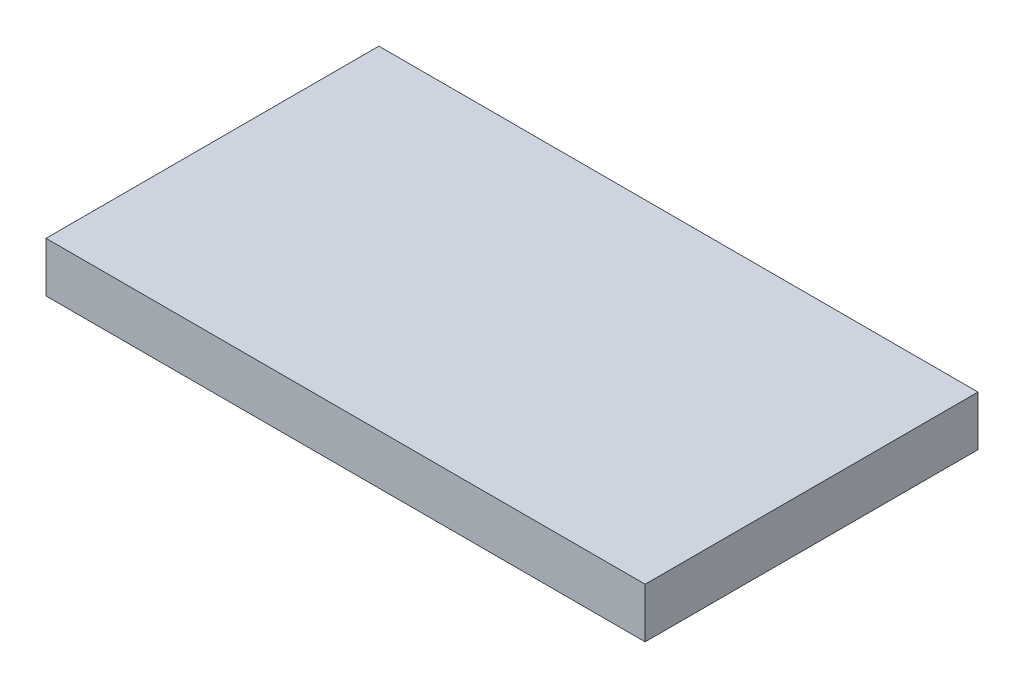
ISO-10303-21;
HEADER;
FILE_DESCRIPTION(('STEP AP214'),'2;1');
FILE_NAME('part.step','',(''),(''),'','','');
FILE_SCHEMA(('AUTOMOTIVE_DESIGN { 1 0 10303 214 1 1 1 1 }'));
ENDSEC;
DATA;
#1=APPLICATION_CONTEXT('core data for automotive mechanical design processes');
#2=APPLICATION_PROTOCOL_DEFINITION('international standard','automotive_design',2000,#1);
#3=PRODUCT_CONTEXT('',#1,'mechanical');
#4=PRODUCT('Part','Part','',(#3));
#5=PRODUCT_RELATED_PRODUCT_CATEGORY('part','',(#4));
#6=PRODUCT_DEFINITION_FORMATION('','',#4);
#7=PRODUCT_DEFINITION_CONTEXT('part definition',#1,'design');
#8=PRODUCT_DEFINITION('design','',#6,#7);
#9=PRODUCT_DEFINITION_SHAPE('','',#8);
#10=(LENGTH_UNIT() NAMED_UNIT(*) SI_UNIT(.MILLI.,.METRE.));
#11=(NAMED_UNIT(*) PLANE_ANGLE_UNIT() SI_UNIT($,.RADIAN.));
#12=(NAMED_UNIT(*) SI_UNIT($,.STERADIAN.) SOLID_ANGLE_UNIT());
#13=UNCERTAINTY_MEASURE_WITH_UNIT(LENGTH_MEASURE(1.E-05),#10,'distance_accuracy_value','');
#14=(GEOMETRIC_REPRESENTATION_CONTEXT(3) GLOBAL_UNCERTAINTY_ASSIGNED_CONTEXT((#13)) GLOBAL_UNIT_ASSIGNED_CONTEXT((#10,
#11,#12)) REPRESENTATION_CONTEXT('',''));
#15=CARTESIAN_POINT('',(0.,0.,0.));
#16=DIRECTION('',(0.,0.,1.));
#17=DIRECTION('',(1.,0.,0.));
#18=AXIS2_PLACEMENT_3D('',#15,#16,#17);
#19=CARTESIAN_POINT('',(-349.545746257883,-3.97192979348886,200.));
#20=DIRECTION('',(0.,1.,0.));
#21=DIRECTION('',(0.,0.,1.));
#22=AXIS2_PLACEMENT_3D('',#19,#20,#21);
#23=PLANE('',#22);
#24=DIRECTION('',(1.,0.,0.));
#25=VECTOR('',#24,1.);
#26=CARTESIAN_POINT('',(-349.545746257883,-3.97192979348886,0.));
#27=LINE('',#26,#25);
#28=CARTESIAN_POINT('',(-349.545746257883,-3.97192979348886,0.));
#29=VERTEX_POINT('',#28);
#30=CARTESIAN_POINT('',(10.4542537421173,-3.97192979348886,0.));
#31=VERTEX_POINT('',#30);
#32=EDGE_CURVE('E95',#29,#31,#27,.T.);
#33=ORIENTED_EDGE('',*,*,#32,.T.);
#34=DIRECTION('',(0.,0.,-1.));
#35=VECTOR('',#34,1.);
#36=CARTESIAN_POINT('',(10.4542537421173,-3.97192979348886,200.));
#37=LINE('',#36,#35);
#38=CARTESIAN_POINT('',(10.4542537421173,-3.97192979348886,200.));
#39=VERTEX_POINT('',#38);
#40=EDGE_CURVE('E48',#39,#31,#37,.T.);
#41=ORIENTED_EDGE('',*,*,#40,.F.);
#42=DIRECTION('',(1.,0.,0.));
#43=VECTOR('',#42,1.);
#44=CARTESIAN_POINT('',(-349.545746257883,-3.97192979348886,200.));
#45=LINE('',#44,#43);
#46=CARTESIAN_POINT('',(-349.545746257883,-3.97192979348886,200.));
#47=VERTEX_POINT('',#46);
#48=EDGE_CURVE('E86',#47,#39,#45,.T.);
#49=ORIENTED_EDGE('',*,*,#48,.F.);
#50=DIRECTION('',(0.,0.,-1.));
#51=VECTOR('',#50,1.);
#52=CARTESIAN_POINT('',(-349.545746257883,-3.97192979348886,200.));
#53=LINE('',#52,#51);
#54=EDGE_CURVE('E11',#47,#29,#53,.T.);
#55=ORIENTED_EDGE('',*,*,#54,.T.);
#56=EDGE_LOOP('',(#33,#41,#49,#55));
#57=FACE_BOUND('',#56,.T.);
#58=ADVANCED_FACE('F39',(#57),#23,.F.);
#59=CARTESIAN_POINT('',(10.4542537421173,4.02807020651121,200.));
#60=DIRECTION('',(-1.,0.,0.));
#61=DIRECTION('',(0.,-1.,0.));
#62=AXIS2_PLACEMENT_3D('',#59,#60,#61);
#63=PLANE('',#62);
#64=DIRECTION('',(0.,1.,0.));
#65=VECTOR('',#64,1.);
#66=CARTESIAN_POINT('',(10.4542537421173,4.02807020651121,0.));
#67=LINE('',#66,#65);
#68=CARTESIAN_POINT('',(10.4542537421173,26.0280702065111,0.));
#69=VERTEX_POINT('',#68);
#70=EDGE_CURVE('E73',#31,#69,#67,.T.);
#71=ORIENTED_EDGE('',*,*,#70,.T.);
#72=DIRECTION('',(0.,0.,-1.));
#73=VECTOR('',#72,1.);
#74=CARTESIAN_POINT('',(10.4542537421173,26.0280702065111,200.));
#75=LINE('',#74,#73);
#76=CARTESIAN_POINT('',(10.4542537421173,26.0280702065111,200.));
#77=VERTEX_POINT('',#76);
#78=EDGE_CURVE('E97',#77,#69,#75,.T.);
#79=ORIENTED_EDGE('',*,*,#78,.F.);
#80=DIRECTION('',(0.,1.,0.));
#81=VECTOR('',#80,1.);
#82=CARTESIAN_POINT('',(10.4542537421173,-3.97192979348886,200.));
#83=LINE('',#82,#81);
#84=EDGE_CURVE('E90',#39,#77,#83,.T.);
#85=ORIENTED_EDGE('',*,*,#84,.F.);
#86=ORIENTED_EDGE('',*,*,#40,.T.);
#87=EDGE_LOOP('',(#71,#79,#85,#86));
#88=FACE_BOUND('',#87,.T.);
#89=ADVANCED_FACE('F98',(#88),#63,.F.);
#90=CARTESIAN_POINT('',(-349.545746257883,26.0280702065111,200.));
#91=DIRECTION('',(0.,-1.,0.));
#92=DIRECTION('',(0.,0.,-1.));
#93=AXIS2_PLACEMENT_3D('',#90,#91,#92);
#94=PLANE('',#93);
#95=DIRECTION('',(-1.,0.,0.));
#96=VECTOR('',#95,1.);
#97=CARTESIAN_POINT('',(-349.545746257883,26.0280702065111,0.));
#98=LINE('',#97,#96);
#99=CARTESIAN_POINT('',(-349.545746257883,26.0280702065111,0.));
#100=VERTEX_POINT('',#99);
#101=EDGE_CURVE('E80',#69,#100,#98,.T.);
#102=ORIENTED_EDGE('',*,*,#101,.T.);
#103=DIRECTION('',(0.,0.,-1.));
#104=VECTOR('',#103,1.);
#105=CARTESIAN_POINT('',(-349.545746257883,26.0280702065111,200.));
#106=LINE('',#105,#104);
#107=CARTESIAN_POINT('',(-349.545746257883,26.0280702065111,200.));
#108=VERTEX_POINT('',#107);
#109=EDGE_CURVE('E104',#108,#100,#106,.T.);
#110=ORIENTED_EDGE('',*,*,#109,.F.);
#111=DIRECTION('',(-1.,0.,0.));
#112=VECTOR('',#111,1.);
#113=CARTESIAN_POINT('',(-349.545746257883,26.0280702065111,200.));
#114=LINE('',#113,#112);
#115=EDGE_CURVE('E101',#77,#108,#114,.T.);
#116=ORIENTED_EDGE('',*,*,#115,.F.);
#117=ORIENTED_EDGE('',*,*,#78,.T.);
#118=EDGE_LOOP('',(#102,#110,#116,#117));
#119=FACE_BOUND('',#118,.T.);
#120=ADVANCED_FACE('F120',(#119),#94,.F.);
#121=CARTESIAN_POINT('',(-349.545746257883,4.02807020651114,200.));
#122=DIRECTION('',(1.,0.,0.));
#123=DIRECTION('',(0.,0.,-1.));
#124=AXIS2_PLACEMENT_3D('',#121,#122,#123);
#125=PLANE('',#124);
#126=DIRECTION('',(0.,-1.,0.));
#127=VECTOR('',#126,1.);
#128=CARTESIAN_POINT('',(-349.545746257883,4.02807020651114,0.));
#129=LINE('',#128,#127);
#130=EDGE_CURVE('E114',#100,#29,#129,.T.);
#131=ORIENTED_EDGE('',*,*,#130,.T.);
#132=ORIENTED_EDGE('',*,*,#54,.F.);
#133=DIRECTION('',(0.,-1.,0.));
#134=VECTOR('',#133,1.);
#135=CARTESIAN_POINT('',(-349.545746257883,-3.97192979348886,200.));
#136=LINE('',#135,#134);
#137=EDGE_CURVE('E56',#108,#47,#136,.T.);
#138=ORIENTED_EDGE('',*,*,#137,.F.);
#139=ORIENTED_EDGE('',*,*,#109,.T.);
#140=EDGE_LOOP('',(#131,#132,#138,#139));
#141=FACE_BOUND('',#140,.T.);
#142=ADVANCED_FACE('F124',(#141),#125,.F.);
#143=CARTESIAN_POINT('',(0.,0.,200.));
#144=DIRECTION('',(0.,0.,-1.));
#145=DIRECTION('',(-1.,0.,0.));
#146=AXIS2_PLACEMENT_3D('',#143,#144,#145);
#147=PLANE('',#146);
#148=ORIENTED_EDGE('',*,*,#137,.T.);
#149=ORIENTED_EDGE('',*,*,#48,.T.);
#150=ORIENTED_EDGE('',*,*,#84,.T.);
#151=ORIENTED_EDGE('',*,*,#115,.T.);
#152=EDGE_LOOP('',(#148,#149,#150,#151));
#153=FACE_BOUND('',#152,.T.);
#154=ADVANCED_FACE('F88',(#153),#147,.F.);
#155=CARTESIAN_POINT('',(0.,0.,0.));
#156=DIRECTION('',(0.,0.,-1.));
#157=DIRECTION('',(-1.,0.,0.));
#158=AXIS2_PLACEMENT_3D('',#155,#156,#157);
#159=PLANE('',#158);
#160=ORIENTED_EDGE('',*,*,#32,.F.);
#161=ORIENTED_EDGE('',*,*,#130,.F.);
#162=ORIENTED_EDGE('',*,*,#101,.F.);
#163=ORIENTED_EDGE('',*,*,#70,.F.);
#164=EDGE_LOOP('',(#160,#161,#162,#163));
#165=FACE_BOUND('',#164,.T.);
#166=ADVANCED_FACE('F123',(#165),#159,.T.);
#167=CLOSED_SHELL('',(#58,#89,#120,#142,#154,#166));
#168=MANIFOLD_SOLID_BREP('B2',#167);
#169=ADVANCED_BREP_SHAPE_REPRESENTATION('',(#18,#168),#14);
#170=SHAPE_DEFINITION_REPRESENTATION(#9,#169);
ENDSEC;
END-ISO-10303-21;
